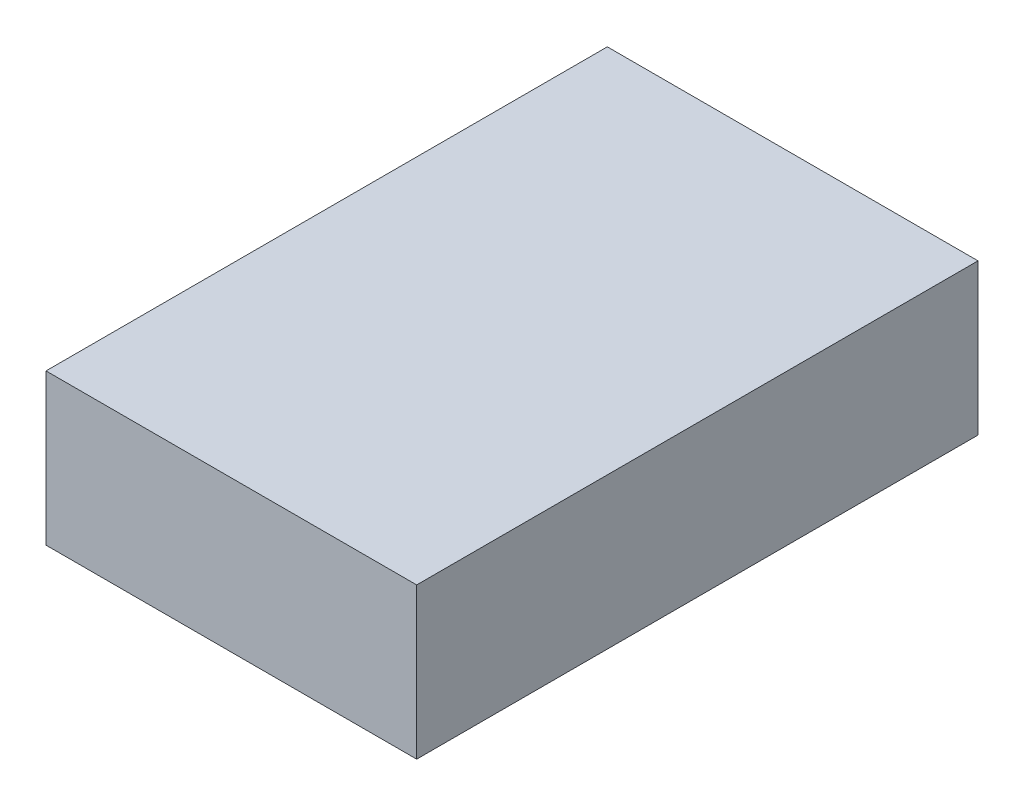
ISO-10303-21;
HEADER;
FILE_DESCRIPTION(('STEP AP214'),'2;1');
FILE_NAME('part.step','',(''),(''),'','','');
FILE_SCHEMA(('AUTOMOTIVE_DESIGN { 1 0 10303 214 1 1 1 1 }'));
ENDSEC;
DATA;
#1=APPLICATION_CONTEXT('core data for automotive mechanical design processes');
#2=APPLICATION_PROTOCOL_DEFINITION('international standard','automotive_design',2000,#1);
#3=PRODUCT_CONTEXT('',#1,'mechanical');
#4=PRODUCT('Part','Part','',(#3));
#5=PRODUCT_RELATED_PRODUCT_CATEGORY('part','',(#4));
#6=PRODUCT_DEFINITION_FORMATION('','',#4);
#7=PRODUCT_DEFINITION_CONTEXT('part definition',#1,'design');
#8=PRODUCT_DEFINITION('design','',#6,#7);
#9=PRODUCT_DEFINITION_SHAPE('','',#8);
#10=(LENGTH_UNIT() NAMED_UNIT(*) SI_UNIT(.MILLI.,.METRE.));
#11=(NAMED_UNIT(*) PLANE_ANGLE_UNIT() SI_UNIT($,.RADIAN.));
#12=(NAMED_UNIT(*) SI_UNIT($,.STERADIAN.) SOLID_ANGLE_UNIT());
#13=UNCERTAINTY_MEASURE_WITH_UNIT(LENGTH_MEASURE(1.E-05),#10,'distance_accuracy_value','');
#14=(GEOMETRIC_REPRESENTATION_CONTEXT(3) GLOBAL_UNCERTAINTY_ASSIGNED_CONTEXT((#13)) GLOBAL_UNIT_ASSIGNED_CONTEXT((#10,
#11,#12)) REPRESENTATION_CONTEXT('',''));
#15=CARTESIAN_POINT('',(0.,0.,0.));
#16=DIRECTION('',(0.,0.,1.));
#17=DIRECTION('',(1.,0.,0.));
#18=AXIS2_PLACEMENT_3D('',#15,#16,#17);
#19=CARTESIAN_POINT('',(-7.304,3.5856,2.584));
#20=DIRECTION('',(0.,0.,-1.));
#21=DIRECTION('',(-1.,0.,0.));
#22=AXIS2_PLACEMENT_3D('',#19,#20,#21);
#23=PLANE('',#22);
#24=DIRECTION('',(1.,0.,0.));
#25=VECTOR('',#24,1.);
#26=CARTESIAN_POINT('',(-7.304,3.0156,2.584));
#27=LINE('',#26,#25);
#28=CARTESIAN_POINT('',(-7.304,3.0156,2.584));
#29=VERTEX_POINT('',#28);
#30=CARTESIAN_POINT('',(-5.904,3.0156,2.584));
#31=VERTEX_POINT('',#30);
#32=EDGE_CURVE('E11',#29,#31,#27,.T.);
#33=ORIENTED_EDGE('',*,*,#32,.T.);
#34=DIRECTION('',(0.,-1.,0.));
#35=VECTOR('',#34,1.);
#36=CARTESIAN_POINT('',(-5.904,3.5856,2.584));
#37=LINE('',#36,#35);
#38=CARTESIAN_POINT('',(-5.904,3.5856,2.584));
#39=VERTEX_POINT('',#38);
#40=EDGE_CURVE('E24',#39,#31,#37,.T.);
#41=ORIENTED_EDGE('',*,*,#40,.F.);
#42=DIRECTION('',(1.,0.,0.));
#43=VECTOR('',#42,1.);
#44=CARTESIAN_POINT('',(-7.304,3.5856,2.584));
#45=LINE('',#44,#43);
#46=CARTESIAN_POINT('',(-7.304,3.5856,2.584));
#47=VERTEX_POINT('',#46);
#48=EDGE_CURVE('E88',#47,#39,#45,.T.);
#49=ORIENTED_EDGE('',*,*,#48,.F.);
#50=DIRECTION('',(0.,-1.,0.));
#51=VECTOR('',#50,1.);
#52=CARTESIAN_POINT('',(-7.304,3.5856,2.584));
#53=LINE('',#52,#51);
#54=EDGE_CURVE('E77',#47,#29,#53,.T.);
#55=ORIENTED_EDGE('',*,*,#54,.T.);
#56=EDGE_LOOP('',(#33,#41,#49,#55));
#57=FACE_BOUND('',#56,.T.);
#58=ADVANCED_FACE('F17',(#57),#23,.F.);
#59=CARTESIAN_POINT('',(-5.904,3.5856,0.463999999999973));
#60=DIRECTION('',(-1.,0.,0.));
#61=DIRECTION('',(0.,0.,1.));
#62=AXIS2_PLACEMENT_3D('',#59,#60,#61);
#63=PLANE('',#62);
#64=DIRECTION('',(0.,0.,-1.));
#65=VECTOR('',#64,1.);
#66=CARTESIAN_POINT('',(-5.904,3.0156,0.463999999999972));
#67=LINE('',#66,#65);
#68=CARTESIAN_POINT('',(-5.904,3.0156,0.463999999999972));
#69=VERTEX_POINT('',#68);
#70=EDGE_CURVE('E85',#31,#69,#67,.T.);
#71=ORIENTED_EDGE('',*,*,#70,.T.);
#72=DIRECTION('',(0.,-1.,0.));
#73=VECTOR('',#72,1.);
#74=CARTESIAN_POINT('',(-5.904,3.5856,0.463999999999973));
#75=LINE('',#74,#73);
#76=CARTESIAN_POINT('',(-5.904,3.5856,0.463999999999973));
#77=VERTEX_POINT('',#76);
#78=EDGE_CURVE('E83',#77,#69,#75,.T.);
#79=ORIENTED_EDGE('',*,*,#78,.F.);
#80=DIRECTION('',(0.,0.,-1.));
#81=VECTOR('',#80,1.);
#82=CARTESIAN_POINT('',(-5.904,3.5856,0.463999999999973));
#83=LINE('',#82,#81);
#84=EDGE_CURVE('E72',#39,#77,#83,.T.);
#85=ORIENTED_EDGE('',*,*,#84,.F.);
#86=ORIENTED_EDGE('',*,*,#40,.T.);
#87=EDGE_LOOP('',(#71,#79,#85,#86));
#88=FACE_BOUND('',#87,.T.);
#89=ADVANCED_FACE('F90',(#88),#63,.F.);
#90=CARTESIAN_POINT('',(-7.304,3.5856,0.463999999999973));
#91=DIRECTION('',(0.,0.,1.));
#92=DIRECTION('',(1.,0.,0.));
#93=AXIS2_PLACEMENT_3D('',#90,#91,#92);
#94=PLANE('',#93);
#95=DIRECTION('',(-1.,0.,0.));
#96=VECTOR('',#95,1.);
#97=CARTESIAN_POINT('',(-7.304,3.0156,0.463999999999972));
#98=LINE('',#97,#96);
#99=CARTESIAN_POINT('',(-7.304,3.0156,0.463999999999972));
#100=VERTEX_POINT('',#99);
#101=EDGE_CURVE('E60',#69,#100,#98,.T.);
#102=ORIENTED_EDGE('',*,*,#101,.T.);
#103=DIRECTION('',(0.,-1.,0.));
#104=VECTOR('',#103,1.);
#105=CARTESIAN_POINT('',(-7.304,3.5856,0.463999999999973));
#106=LINE('',#105,#104);
#107=CARTESIAN_POINT('',(-7.304,3.5856,0.463999999999973));
#108=VERTEX_POINT('',#107);
#109=EDGE_CURVE('E54',#108,#100,#106,.T.);
#110=ORIENTED_EDGE('',*,*,#109,.F.);
#111=DIRECTION('',(-1.,0.,0.));
#112=VECTOR('',#111,1.);
#113=CARTESIAN_POINT('',(-7.304,3.5856,0.463999999999973));
#114=LINE('',#113,#112);
#115=EDGE_CURVE('E58',#77,#108,#114,.T.);
#116=ORIENTED_EDGE('',*,*,#115,.F.);
#117=ORIENTED_EDGE('',*,*,#78,.T.);
#118=EDGE_LOOP('',(#102,#110,#116,#117));
#119=FACE_BOUND('',#118,.T.);
#120=ADVANCED_FACE('F56',(#119),#94,.F.);
#121=CARTESIAN_POINT('',(-7.304,3.5856,0.463999999999973));
#122=DIRECTION('',(1.,0.,0.));
#123=DIRECTION('',(0.,0.,-1.));
#124=AXIS2_PLACEMENT_3D('',#121,#122,#123);
#125=PLANE('',#124);
#126=DIRECTION('',(0.,0.,1.));
#127=VECTOR('',#126,1.);
#128=CARTESIAN_POINT('',(-7.304,3.0156,0.463999999999972));
#129=LINE('',#128,#127);
#130=EDGE_CURVE('E73',#100,#29,#129,.T.);
#131=ORIENTED_EDGE('',*,*,#130,.T.);
#132=ORIENTED_EDGE('',*,*,#54,.F.);
#133=DIRECTION('',(0.,0.,1.));
#134=VECTOR('',#133,1.);
#135=CARTESIAN_POINT('',(-7.304,3.5856,0.463999999999973));
#136=LINE('',#135,#134);
#137=EDGE_CURVE('E70',#108,#47,#136,.T.);
#138=ORIENTED_EDGE('',*,*,#137,.F.);
#139=ORIENTED_EDGE('',*,*,#109,.T.);
#140=EDGE_LOOP('',(#131,#132,#138,#139));
#141=FACE_BOUND('',#140,.T.);
#142=ADVANCED_FACE('F76',(#141),#125,.F.);
#143=CARTESIAN_POINT('',(-6.604,3.5856,1.524));
#144=DIRECTION('',(0.,-1.,0.));
#145=DIRECTION('',(1.,0.,0.));
#146=AXIS2_PLACEMENT_3D('',#143,#144,#145);
#147=PLANE('',#146);
#148=ORIENTED_EDGE('',*,*,#48,.T.);
#149=ORIENTED_EDGE('',*,*,#84,.T.);
#150=ORIENTED_EDGE('',*,*,#115,.T.);
#151=ORIENTED_EDGE('',*,*,#137,.T.);
#152=EDGE_LOOP('',(#148,#149,#150,#151));
#153=FACE_BOUND('',#152,.T.);
#154=ADVANCED_FACE('F69',(#153),#147,.F.);
#155=CARTESIAN_POINT('',(-6.604,3.0156,1.524));
#156=DIRECTION('',(0.,-1.,0.));
#157=DIRECTION('',(1.,0.,0.));
#158=AXIS2_PLACEMENT_3D('',#155,#156,#157);
#159=PLANE('',#158);
#160=ORIENTED_EDGE('',*,*,#32,.F.);
#161=ORIENTED_EDGE('',*,*,#130,.F.);
#162=ORIENTED_EDGE('',*,*,#101,.F.);
#163=ORIENTED_EDGE('',*,*,#70,.F.);
#164=EDGE_LOOP('',(#160,#161,#162,#163));
#165=FACE_BOUND('',#164,.T.);
#166=ADVANCED_FACE('F91',(#165),#159,.T.);
#167=CLOSED_SHELL('',(#58,#89,#120,#142,#154,#166));
#168=MANIFOLD_SOLID_BREP('B1',#167);
#169=ADVANCED_BREP_SHAPE_REPRESENTATION('',(#18,#168),#14);
#170=SHAPE_DEFINITION_REPRESENTATION(#9,#169);
ENDSEC;
END-ISO-10303-21;
